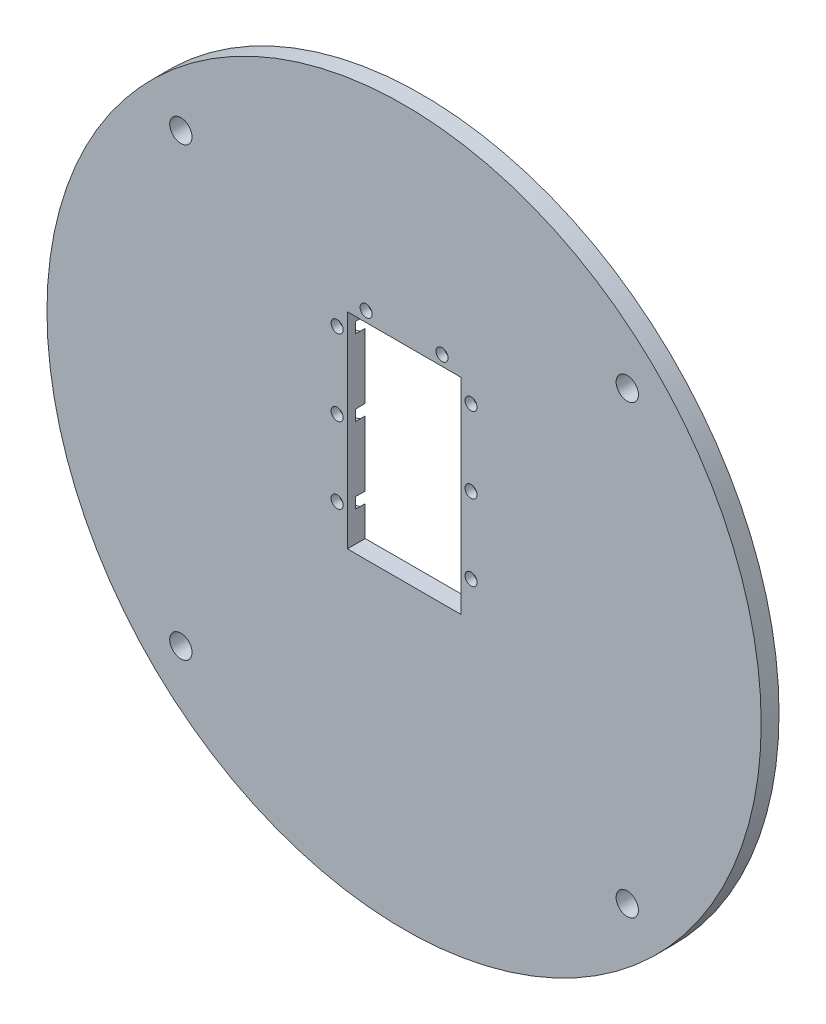
ISO-10303-21;
HEADER;
FILE_DESCRIPTION(('STEP AP214'),'2;1');
FILE_NAME('part.step','',(''),(''),'','','');
FILE_SCHEMA(('AUTOMOTIVE_DESIGN { 1 0 10303 214 1 1 1 1 }'));
ENDSEC;
DATA;
#1=APPLICATION_CONTEXT('core data for automotive mechanical design processes');
#2=APPLICATION_PROTOCOL_DEFINITION('international standard','automotive_design',2000,#1);
#3=PRODUCT_CONTEXT('',#1,'mechanical');
#4=PRODUCT('Part','Part','',(#3));
#5=PRODUCT_RELATED_PRODUCT_CATEGORY('part','',(#4));
#6=PRODUCT_DEFINITION_FORMATION('','',#4);
#7=PRODUCT_DEFINITION_CONTEXT('part definition',#1,'design');
#8=PRODUCT_DEFINITION('design','',#6,#7);
#9=PRODUCT_DEFINITION_SHAPE('','',#8);
#10=(LENGTH_UNIT() NAMED_UNIT(*) SI_UNIT(.MILLI.,.METRE.));
#11=(NAMED_UNIT(*) PLANE_ANGLE_UNIT() SI_UNIT($,.RADIAN.));
#12=(NAMED_UNIT(*) SI_UNIT($,.STERADIAN.) SOLID_ANGLE_UNIT());
#13=UNCERTAINTY_MEASURE_WITH_UNIT(LENGTH_MEASURE(1.E-05),#10,'distance_accuracy_value','');
#14=(GEOMETRIC_REPRESENTATION_CONTEXT(3) GLOBAL_UNCERTAINTY_ASSIGNED_CONTEXT((#13)) GLOBAL_UNIT_ASSIGNED_CONTEXT((#10,
#11,#12)) REPRESENTATION_CONTEXT('',''));
#15=CARTESIAN_POINT('',(0.,0.,0.));
#16=DIRECTION('',(0.,0.,1.));
#17=DIRECTION('',(1.,0.,0.));
#18=AXIS2_PLACEMENT_3D('',#15,#16,#17);
#19=CARTESIAN_POINT('',(-15.,-4.5,500000.));
#20=DIRECTION('',(0.,0.,-1.));
#21=DIRECTION('',(-1.,0.,0.));
#22=AXIS2_PLACEMENT_3D('',#19,#20,#21);
#23=CYLINDRICAL_SURFACE('',#22,1.35);
#24=CARTESIAN_POINT('',(-15.,-4.5,4.0000000000191));
#25=DIRECTION('',(0.,0.,1.));
#26=DIRECTION('',(1.,0.,0.));
#27=AXIS2_PLACEMENT_3D('',#24,#25,#26);
#28=CIRCLE('',#27,1.35);
#29=CARTESIAN_POINT('',(-13.65,-4.5,4.0000000000191));
#30=VERTEX_POINT('',#29);
#31=EDGE_CURVE('E289',#30,#30,#28,.T.);
#32=ORIENTED_EDGE('',*,*,#31,.T.);
#33=EDGE_LOOP('',(#32));
#34=FACE_BOUND('',#33,.T.);
#35=CARTESIAN_POINT('',(-15.,-4.5,2.20000000001619));
#36=DIRECTION('',(0.,0.,-1.));
#37=DIRECTION('',(-1.,0.,0.));
#38=AXIS2_PLACEMENT_3D('',#35,#36,#37);
#39=CIRCLE('',#38,1.35);
#40=CARTESIAN_POINT('',(-16.35,-4.5,2.20000000001619));
#41=VERTEX_POINT('',#40);
#42=EDGE_CURVE('E398',#41,#41,#39,.T.);
#43=ORIENTED_EDGE('',*,*,#42,.T.);
#44=EDGE_LOOP('',(#43));
#45=FACE_BOUND('',#44,.T.);
#46=ADVANCED_FACE('F40',(#34,#45),#23,.F.);
#47=CARTESIAN_POINT('',(15.,-4.5,500000.));
#48=DIRECTION('',(0.,0.,-1.));
#49=DIRECTION('',(-1.,0.,0.));
#50=AXIS2_PLACEMENT_3D('',#47,#48,#49);
#51=CYLINDRICAL_SURFACE('',#50,1.35);
#52=CARTESIAN_POINT('',(15.,-4.5,4.0000000000191));
#53=DIRECTION('',(0.,0.,1.));
#54=DIRECTION('',(1.,0.,0.));
#55=AXIS2_PLACEMENT_3D('',#52,#53,#54);
#56=CIRCLE('',#55,1.35);
#57=CARTESIAN_POINT('',(16.35,-4.5,4.0000000000191));
#58=VERTEX_POINT('',#57);
#59=EDGE_CURVE('E318',#58,#58,#56,.T.);
#60=ORIENTED_EDGE('',*,*,#59,.T.);
#61=EDGE_LOOP('',(#60));
#62=FACE_BOUND('',#61,.T.);
#63=CARTESIAN_POINT('',(15.,-4.5,2.20000000001619));
#64=DIRECTION('',(0.,0.,-1.));
#65=DIRECTION('',(-1.,0.,0.));
#66=AXIS2_PLACEMENT_3D('',#63,#64,#65);
#67=CIRCLE('',#66,1.35);
#68=CARTESIAN_POINT('',(13.65,-4.5,2.20000000001619));
#69=VERTEX_POINT('',#68);
#70=EDGE_CURVE('E390',#69,#69,#67,.T.);
#71=ORIENTED_EDGE('',*,*,#70,.T.);
#72=EDGE_LOOP('',(#71));
#73=FACE_BOUND('',#72,.T.);
#74=ADVANCED_FACE('F602',(#62,#73),#51,.F.);
#75=CARTESIAN_POINT('',(15.,12.5,500000.));
#76=DIRECTION('',(0.,0.,-1.));
#77=DIRECTION('',(-1.,0.,0.));
#78=AXIS2_PLACEMENT_3D('',#75,#76,#77);
#79=CYLINDRICAL_SURFACE('',#78,1.35);
#80=CARTESIAN_POINT('',(15.,12.5,4.0000000000191));
#81=DIRECTION('',(0.,0.,1.));
#82=DIRECTION('',(1.,0.,0.));
#83=AXIS2_PLACEMENT_3D('',#80,#81,#82);
#84=CIRCLE('',#83,1.35);
#85=CARTESIAN_POINT('',(16.35,12.5,4.0000000000191));
#86=VERTEX_POINT('',#85);
#87=EDGE_CURVE('E314',#86,#86,#84,.T.);
#88=ORIENTED_EDGE('',*,*,#87,.T.);
#89=EDGE_LOOP('',(#88));
#90=FACE_BOUND('',#89,.T.);
#91=CARTESIAN_POINT('',(15.,12.5,2.20000000001619));
#92=DIRECTION('',(0.,0.,-1.));
#93=DIRECTION('',(-1.,0.,0.));
#94=AXIS2_PLACEMENT_3D('',#91,#92,#93);
#95=CIRCLE('',#94,1.35);
#96=CARTESIAN_POINT('',(13.65,12.5,2.20000000001619));
#97=VERTEX_POINT('',#96);
#98=EDGE_CURVE('E378',#97,#97,#95,.T.);
#99=ORIENTED_EDGE('',*,*,#98,.T.);
#100=EDGE_LOOP('',(#99));
#101=FACE_BOUND('',#100,.T.);
#102=ADVANCED_FACE('F609',(#90,#101),#79,.F.);
#103=CARTESIAN_POINT('',(15.,29.5,500000.));
#104=DIRECTION('',(0.,0.,-1.));
#105=DIRECTION('',(-1.,0.,0.));
#106=AXIS2_PLACEMENT_3D('',#103,#104,#105);
#107=CYLINDRICAL_SURFACE('',#106,1.35);
#108=CARTESIAN_POINT('',(15.,29.5,4.0000000000191));
#109=DIRECTION('',(0.,0.,1.));
#110=DIRECTION('',(1.,0.,0.));
#111=AXIS2_PLACEMENT_3D('',#108,#109,#110);
#112=CIRCLE('',#111,1.35);
#113=CARTESIAN_POINT('',(16.35,29.5,4.0000000000191));
#114=VERTEX_POINT('',#113);
#115=EDGE_CURVE('E310',#114,#114,#112,.T.);
#116=ORIENTED_EDGE('',*,*,#115,.T.);
#117=EDGE_LOOP('',(#116));
#118=FACE_BOUND('',#117,.T.);
#119=CARTESIAN_POINT('',(15.,29.5,2.20000000001619));
#120=DIRECTION('',(0.,0.,-1.));
#121=DIRECTION('',(-1.,0.,0.));
#122=AXIS2_PLACEMENT_3D('',#119,#120,#121);
#123=CIRCLE('',#122,1.35);
#124=CARTESIAN_POINT('',(13.65,29.5,2.20000000001619));
#125=VERTEX_POINT('',#124);
#126=EDGE_CURVE('E366',#125,#125,#123,.T.);
#127=ORIENTED_EDGE('',*,*,#126,.T.);
#128=EDGE_LOOP('',(#127));
#129=FACE_BOUND('',#128,.T.);
#130=ADVANCED_FACE('F794',(#118,#129),#107,.F.);
#131=CARTESIAN_POINT('',(8.5,35.8,500000.));
#132=DIRECTION('',(0.,0.,-1.));
#133=DIRECTION('',(-1.,0.,0.));
#134=AXIS2_PLACEMENT_3D('',#131,#132,#133);
#135=CYLINDRICAL_SURFACE('',#134,1.35);
#136=CARTESIAN_POINT('',(8.5,35.8,4.0000000000191));
#137=DIRECTION('',(0.,0.,1.));
#138=DIRECTION('',(1.,0.,0.));
#139=AXIS2_PLACEMENT_3D('',#136,#137,#138);
#140=CIRCLE('',#139,1.35);
#141=CARTESIAN_POINT('',(9.85,35.8,4.0000000000191));
#142=VERTEX_POINT('',#141);
#143=EDGE_CURVE('E306',#142,#142,#140,.T.);
#144=ORIENTED_EDGE('',*,*,#143,.T.);
#145=EDGE_LOOP('',(#144));
#146=FACE_BOUND('',#145,.T.);
#147=CARTESIAN_POINT('',(8.5,35.8,2.20000000001619));
#148=DIRECTION('',(0.,0.,-1.));
#149=DIRECTION('',(-1.,0.,0.));
#150=AXIS2_PLACEMENT_3D('',#147,#148,#149);
#151=CIRCLE('',#150,1.35);
#152=CARTESIAN_POINT('',(7.15,35.8,2.20000000001619));
#153=VERTEX_POINT('',#152);
#154=EDGE_CURVE('E355',#153,#153,#151,.T.);
#155=ORIENTED_EDGE('',*,*,#154,.T.);
#156=EDGE_LOOP('',(#155));
#157=FACE_BOUND('',#156,.T.);
#158=ADVANCED_FACE('F802',(#146,#157),#135,.F.);
#159=CARTESIAN_POINT('',(-8.5,35.8,500000.));
#160=DIRECTION('',(0.,0.,-1.));
#161=DIRECTION('',(-1.,0.,0.));
#162=AXIS2_PLACEMENT_3D('',#159,#160,#161);
#163=CYLINDRICAL_SURFACE('',#162,1.35);
#164=CARTESIAN_POINT('',(-8.5,35.8,4.0000000000191));
#165=DIRECTION('',(0.,0.,1.));
#166=DIRECTION('',(1.,0.,0.));
#167=AXIS2_PLACEMENT_3D('',#164,#165,#166);
#168=CIRCLE('',#167,1.35);
#169=CARTESIAN_POINT('',(-7.15,35.8,4.0000000000191));
#170=VERTEX_POINT('',#169);
#171=EDGE_CURVE('E302',#170,#170,#168,.T.);
#172=ORIENTED_EDGE('',*,*,#171,.T.);
#173=EDGE_LOOP('',(#172));
#174=FACE_BOUND('',#173,.T.);
#175=CARTESIAN_POINT('',(-8.5,35.8,2.20000000001619));
#176=DIRECTION('',(0.,0.,-1.));
#177=DIRECTION('',(-1.,0.,0.));
#178=AXIS2_PLACEMENT_3D('',#175,#176,#177);
#179=CIRCLE('',#178,1.35);
#180=CARTESIAN_POINT('',(-9.85,35.8,2.20000000001619));
#181=VERTEX_POINT('',#180);
#182=EDGE_CURVE('E345',#181,#181,#179,.T.);
#183=ORIENTED_EDGE('',*,*,#182,.T.);
#184=EDGE_LOOP('',(#183));
#185=FACE_BOUND('',#184,.T.);
#186=ADVANCED_FACE('F811',(#174,#185),#163,.F.);
#187=CARTESIAN_POINT('',(-15.,29.5,500000.));
#188=DIRECTION('',(0.,0.,-1.));
#189=DIRECTION('',(-1.,0.,0.));
#190=AXIS2_PLACEMENT_3D('',#187,#188,#189);
#191=CYLINDRICAL_SURFACE('',#190,1.35);
#192=CARTESIAN_POINT('',(-15.,29.5,4.0000000000191));
#193=DIRECTION('',(0.,0.,1.));
#194=DIRECTION('',(1.,0.,0.));
#195=AXIS2_PLACEMENT_3D('',#192,#193,#194);
#196=CIRCLE('',#195,1.35);
#197=CARTESIAN_POINT('',(-13.65,29.5,4.0000000000191));
#198=VERTEX_POINT('',#197);
#199=EDGE_CURVE('E298',#198,#198,#196,.T.);
#200=ORIENTED_EDGE('',*,*,#199,.T.);
#201=EDGE_LOOP('',(#200));
#202=FACE_BOUND('',#201,.T.);
#203=CARTESIAN_POINT('',(-15.,29.5,2.20000000001619));
#204=DIRECTION('',(0.,0.,-1.));
#205=DIRECTION('',(-1.,0.,0.));
#206=AXIS2_PLACEMENT_3D('',#203,#204,#205);
#207=CIRCLE('',#206,1.35);
#208=CARTESIAN_POINT('',(-16.35,29.5,2.20000000001619));
#209=VERTEX_POINT('',#208);
#210=EDGE_CURVE('E335',#209,#209,#207,.T.);
#211=ORIENTED_EDGE('',*,*,#210,.T.);
#212=EDGE_LOOP('',(#211));
#213=FACE_BOUND('',#212,.T.);
#214=ADVANCED_FACE('F820',(#202,#213),#191,.F.);
#215=CARTESIAN_POINT('',(-15.,12.5,500000.));
#216=DIRECTION('',(0.,0.,-1.));
#217=DIRECTION('',(-1.,0.,0.));
#218=AXIS2_PLACEMENT_3D('',#215,#216,#217);
#219=CYLINDRICAL_SURFACE('',#218,1.35);
#220=CARTESIAN_POINT('',(-15.,12.5,4.0000000000191));
#221=DIRECTION('',(0.,0.,1.));
#222=DIRECTION('',(1.,0.,0.));
#223=AXIS2_PLACEMENT_3D('',#220,#221,#222);
#224=CIRCLE('',#223,1.35);
#225=CARTESIAN_POINT('',(-13.65,12.5,4.0000000000191));
#226=VERTEX_POINT('',#225);
#227=EDGE_CURVE('E294',#226,#226,#224,.T.);
#228=ORIENTED_EDGE('',*,*,#227,.T.);
#229=EDGE_LOOP('',(#228));
#230=FACE_BOUND('',#229,.T.);
#231=CARTESIAN_POINT('',(-15.,12.5,2.20000000001619));
#232=DIRECTION('',(0.,0.,-1.));
#233=DIRECTION('',(-1.,0.,0.));
#234=AXIS2_PLACEMENT_3D('',#231,#232,#233);
#235=CIRCLE('',#234,1.35);
#236=CARTESIAN_POINT('',(-16.35,12.5,2.20000000001619));
#237=VERTEX_POINT('',#236);
#238=EDGE_CURVE('E325',#237,#237,#235,.T.);
#239=ORIENTED_EDGE('',*,*,#238,.T.);
#240=EDGE_LOOP('',(#239));
#241=FACE_BOUND('',#240,.T.);
#242=ADVANCED_FACE('F614',(#230,#241),#219,.F.);
#243=CARTESIAN_POINT('',(-50.,-50.,4.));
#244=DIRECTION('',(0.,0.,-1.));
#245=DIRECTION('',(-1.,0.,0.));
#246=AXIS2_PLACEMENT_3D('',#243,#244,#245);
#247=CYLINDRICAL_SURFACE('',#246,2.5);
#248=CARTESIAN_POINT('',(-50.,-50.,4.));
#249=DIRECTION('',(0.,0.,1.));
#250=DIRECTION('',(1.,0.,0.));
#251=AXIS2_PLACEMENT_3D('',#248,#249,#250);
#252=CIRCLE('',#251,2.5);
#253=CARTESIAN_POINT('',(-47.5,-50.,4.));
#254=VERTEX_POINT('',#253);
#255=EDGE_CURVE('E499',#254,#254,#252,.T.);
#256=ORIENTED_EDGE('',*,*,#255,.T.);
#257=EDGE_LOOP('',(#256));
#258=FACE_BOUND('',#257,.T.);
#259=CARTESIAN_POINT('',(-50.,-50.,0.));
#260=DIRECTION('',(0.,0.,1.));
#261=DIRECTION('',(1.,0.,0.));
#262=AXIS2_PLACEMENT_3D('',#259,#260,#261);
#263=CIRCLE('',#262,2.5);
#264=CARTESIAN_POINT('',(-47.5,-50.,0.));
#265=VERTEX_POINT('',#264);
#266=EDGE_CURVE('E485',#265,#265,#263,.T.);
#267=ORIENTED_EDGE('',*,*,#266,.F.);
#268=EDGE_LOOP('',(#267));
#269=FACE_BOUND('',#268,.T.);
#270=ADVANCED_FACE('F634',(#258,#269),#247,.F.);
#271=CARTESIAN_POINT('',(-50.,50.,4.));
#272=DIRECTION('',(0.,0.,-1.));
#273=DIRECTION('',(-1.,0.,0.));
#274=AXIS2_PLACEMENT_3D('',#271,#272,#273);
#275=CYLINDRICAL_SURFACE('',#274,2.5);
#276=CARTESIAN_POINT('',(-50.,50.,4.));
#277=DIRECTION('',(0.,0.,1.));
#278=DIRECTION('',(1.,0.,0.));
#279=AXIS2_PLACEMENT_3D('',#276,#277,#278);
#280=CIRCLE('',#279,2.5);
#281=CARTESIAN_POINT('',(-47.5,50.,4.));
#282=VERTEX_POINT('',#281);
#283=EDGE_CURVE('E503',#282,#282,#280,.T.);
#284=ORIENTED_EDGE('',*,*,#283,.T.);
#285=EDGE_LOOP('',(#284));
#286=FACE_BOUND('',#285,.T.);
#287=CARTESIAN_POINT('',(-50.,50.,0.));
#288=DIRECTION('',(0.,0.,1.));
#289=DIRECTION('',(1.,0.,0.));
#290=AXIS2_PLACEMENT_3D('',#287,#288,#289);
#291=CIRCLE('',#290,2.5);
#292=CARTESIAN_POINT('',(-47.5,50.,0.));
#293=VERTEX_POINT('',#292);
#294=EDGE_CURVE('E489',#293,#293,#291,.T.);
#295=ORIENTED_EDGE('',*,*,#294,.F.);
#296=EDGE_LOOP('',(#295));
#297=FACE_BOUND('',#296,.T.);
#298=ADVANCED_FACE('F637',(#286,#297),#275,.F.);
#299=CARTESIAN_POINT('',(50.,50.,4.));
#300=DIRECTION('',(0.,0.,-1.));
#301=DIRECTION('',(-1.,0.,0.));
#302=AXIS2_PLACEMENT_3D('',#299,#300,#301);
#303=CYLINDRICAL_SURFACE('',#302,2.5);
#304=CARTESIAN_POINT('',(50.,50.,4.));
#305=DIRECTION('',(0.,0.,1.));
#306=DIRECTION('',(1.,0.,0.));
#307=AXIS2_PLACEMENT_3D('',#304,#305,#306);
#308=CIRCLE('',#307,2.5);
#309=CARTESIAN_POINT('',(52.5,50.,4.));
#310=VERTEX_POINT('',#309);
#311=EDGE_CURVE('E507',#310,#310,#308,.T.);
#312=ORIENTED_EDGE('',*,*,#311,.T.);
#313=EDGE_LOOP('',(#312));
#314=FACE_BOUND('',#313,.T.);
#315=CARTESIAN_POINT('',(50.,50.,0.));
#316=DIRECTION('',(0.,0.,1.));
#317=DIRECTION('',(1.,0.,0.));
#318=AXIS2_PLACEMENT_3D('',#315,#316,#317);
#319=CIRCLE('',#318,2.5);
#320=CARTESIAN_POINT('',(52.5,50.,0.));
#321=VERTEX_POINT('',#320);
#322=EDGE_CURVE('E253',#321,#321,#319,.T.);
#323=ORIENTED_EDGE('',*,*,#322,.F.);
#324=EDGE_LOOP('',(#323));
#325=FACE_BOUND('',#324,.T.);
#326=ADVANCED_FACE('F640',(#314,#325),#303,.F.);
#327=CARTESIAN_POINT('',(50.,-50.,4.));
#328=DIRECTION('',(0.,0.,-1.));
#329=DIRECTION('',(-1.,0.,0.));
#330=AXIS2_PLACEMENT_3D('',#327,#328,#329);
#331=CYLINDRICAL_SURFACE('',#330,2.5);
#332=CARTESIAN_POINT('',(50.,-50.,4.));
#333=DIRECTION('',(0.,0.,1.));
#334=DIRECTION('',(1.,0.,0.));
#335=AXIS2_PLACEMENT_3D('',#332,#333,#334);
#336=CIRCLE('',#335,2.5);
#337=CARTESIAN_POINT('',(52.5,-50.,4.));
#338=VERTEX_POINT('',#337);
#339=EDGE_CURVE('E484',#338,#338,#336,.T.);
#340=ORIENTED_EDGE('',*,*,#339,.T.);
#341=EDGE_LOOP('',(#340));
#342=FACE_BOUND('',#341,.T.);
#343=CARTESIAN_POINT('',(50.,-50.,0.));
#344=DIRECTION('',(0.,0.,1.));
#345=DIRECTION('',(1.,0.,0.));
#346=AXIS2_PLACEMENT_3D('',#343,#344,#345);
#347=CIRCLE('',#346,2.5);
#348=CARTESIAN_POINT('',(52.5,-50.,0.));
#349=VERTEX_POINT('',#348);
#350=EDGE_CURVE('E245',#349,#349,#347,.T.);
#351=ORIENTED_EDGE('',*,*,#350,.F.);
#352=EDGE_LOOP('',(#351));
#353=FACE_BOUND('',#352,.T.);
#354=ADVANCED_FACE('F42',(#342,#353),#331,.F.);
#355=CARTESIAN_POINT('',(0.,0.,4.));
#356=DIRECTION('',(0.,0.,-1.));
#357=DIRECTION('',(-1.,0.,0.));
#358=AXIS2_PLACEMENT_3D('',#355,#356,#357);
#359=CYLINDRICAL_SURFACE('',#358,80.);
#360=CARTESIAN_POINT('',(0.,0.,4.));
#361=DIRECTION('',(0.,0.,1.));
#362=DIRECTION('',(1.,0.,0.));
#363=AXIS2_PLACEMENT_3D('',#360,#361,#362);
#364=CIRCLE('',#363,80.);
#365=CARTESIAN_POINT('',(80.,0.,4.));
#366=VERTEX_POINT('',#365);
#367=EDGE_CURVE('E477',#366,#366,#364,.T.);
#368=ORIENTED_EDGE('',*,*,#367,.F.);
#369=EDGE_LOOP('',(#368));
#370=FACE_BOUND('',#369,.T.);
#371=CARTESIAN_POINT('',(0.,0.,0.));
#372=DIRECTION('',(0.,0.,1.));
#373=DIRECTION('',(1.,0.,0.));
#374=AXIS2_PLACEMENT_3D('',#371,#372,#373);
#375=CIRCLE('',#374,80.);
#376=CARTESIAN_POINT('',(80.,0.,0.));
#377=VERTEX_POINT('',#376);
#378=EDGE_CURVE('E480',#377,#377,#375,.T.);
#379=ORIENTED_EDGE('',*,*,#378,.T.);
#380=EDGE_LOOP('',(#379));
#381=FACE_BOUND('',#380,.T.);
#382=ADVANCED_FACE('F627',(#370,#381),#359,.T.);
#383=CARTESIAN_POINT('',(0.,0.,4.));
#384=DIRECTION('',(0.,0.,1.));
#385=DIRECTION('',(1.,0.,0.));
#386=AXIS2_PLACEMENT_3D('',#383,#384,#385);
#387=PLANE('',#386);
#388=ORIENTED_EDGE('',*,*,#59,.F.);
#389=EDGE_LOOP('',(#388));
#390=FACE_BOUND('',#389,.T.);
#391=ORIENTED_EDGE('',*,*,#87,.F.);
#392=EDGE_LOOP('',(#391));
#393=FACE_BOUND('',#392,.T.);
#394=ORIENTED_EDGE('',*,*,#115,.F.);
#395=EDGE_LOOP('',(#394));
#396=FACE_BOUND('',#395,.T.);
#397=ORIENTED_EDGE('',*,*,#143,.F.);
#398=EDGE_LOOP('',(#397));
#399=FACE_BOUND('',#398,.T.);
#400=ORIENTED_EDGE('',*,*,#171,.F.);
#401=EDGE_LOOP('',(#400));
#402=FACE_BOUND('',#401,.T.);
#403=ORIENTED_EDGE('',*,*,#199,.F.);
#404=EDGE_LOOP('',(#403));
#405=FACE_BOUND('',#404,.T.);
#406=ORIENTED_EDGE('',*,*,#227,.F.);
#407=EDGE_LOOP('',(#406));
#408=FACE_BOUND('',#407,.T.);
#409=ORIENTED_EDGE('',*,*,#31,.F.);
#410=EDGE_LOOP('',(#409));
#411=FACE_BOUND('',#410,.T.);
#412=DIRECTION('',(1.,0.,0.));
#413=VECTOR('',#412,1.);
#414=CARTESIAN_POINT('',(0.,33.5,4.0000000000191));
#415=LINE('',#414,#413);
#416=CARTESIAN_POINT('',(-12.7,33.5,4.00000000013279));
#417=VERTEX_POINT('',#416);
#418=CARTESIAN_POINT('',(12.7,33.5,4.00000000013279));
#419=VERTEX_POINT('',#418);
#420=EDGE_CURVE('E526',#417,#419,#415,.T.);
#421=ORIENTED_EDGE('',*,*,#420,.T.);
#422=DIRECTION('',(0.,1.,0.));
#423=VECTOR('',#422,1.);
#424=CARTESIAN_POINT('',(12.7,-10.581372337205,4.0000000000191));
#425=LINE('',#424,#423);
#426=CARTESIAN_POINT('',(12.7,-12.5,4.00000000013279));
#427=VERTEX_POINT('',#426);
#428=EDGE_CURVE('E293',#427,#419,#425,.T.);
#429=ORIENTED_EDGE('',*,*,#428,.F.);
#430=DIRECTION('',(1.,0.,0.));
#431=VECTOR('',#430,1.);
#432=CARTESIAN_POINT('',(0.,-12.5,4.0000000000191));
#433=LINE('',#432,#431);
#434=CARTESIAN_POINT('',(-12.7,-12.5,4.));
#435=VERTEX_POINT('',#434);
#436=EDGE_CURVE('E529',#435,#427,#433,.T.);
#437=ORIENTED_EDGE('',*,*,#436,.F.);
#438=DIRECTION('',(0.,1.,0.));
#439=VECTOR('',#438,1.);
#440=CARTESIAN_POINT('',(-12.7,-10.581372337205,4.0000000000191));
#441=LINE('',#440,#439);
#442=EDGE_CURVE('E533',#435,#417,#441,.T.);
#443=ORIENTED_EDGE('',*,*,#442,.T.);
#444=EDGE_LOOP('',(#421,#429,#437,#443));
#445=FACE_BOUND('',#444,.T.);
#446=ORIENTED_EDGE('',*,*,#339,.F.);
#447=EDGE_LOOP('',(#446));
#448=FACE_BOUND('',#447,.T.);
#449=ORIENTED_EDGE('',*,*,#311,.F.);
#450=EDGE_LOOP('',(#449));
#451=FACE_BOUND('',#450,.T.);
#452=ORIENTED_EDGE('',*,*,#283,.F.);
#453=EDGE_LOOP('',(#452));
#454=FACE_BOUND('',#453,.T.);
#455=ORIENTED_EDGE('',*,*,#255,.F.);
#456=EDGE_LOOP('',(#455));
#457=FACE_BOUND('',#456,.T.);
#458=ORIENTED_EDGE('',*,*,#367,.T.);
#459=EDGE_LOOP('',(#458));
#460=FACE_BOUND('',#459,.T.);
#461=ADVANCED_FACE('F541',(#390,#393,#396,#399,#402,#405,#408,#411,#445,#448,#451,#454,#457,
#460),#387,.T.);
#462=CARTESIAN_POINT('',(0.,0.,0.));
#463=DIRECTION('',(0.,0.,1.));
#464=DIRECTION('',(1.,0.,0.));
#465=AXIS2_PLACEMENT_3D('',#462,#463,#464);
#466=PLANE('',#465);
#467=DIRECTION('',(0.,1.,0.));
#468=VECTOR('',#467,1.);
#469=CARTESIAN_POINT('',(-12.7,-10.581372337205,0.));
#470=LINE('',#469,#468);
#471=CARTESIAN_POINT('',(-12.7,-3.28756443470179,0.));
#472=VERTEX_POINT('',#471);
#473=CARTESIAN_POINT('',(-12.7,11.2875644347018,0.));
#474=VERTEX_POINT('',#473);
#475=EDGE_CURVE('E237',#472,#474,#470,.T.);
#476=ORIENTED_EDGE('',*,*,#475,.F.);
#477=CARTESIAN_POINT('',(-15.,-4.5,0.));
#478=DIRECTION('',(0.,0.,-1.));
#479=DIRECTION('',(1.,0.,0.));
#480=AXIS2_PLACEMENT_3D('',#477,#478,#479);
#481=CIRCLE('',#480,2.6);
#482=CARTESIAN_POINT('',(-12.7,-5.71243556529822,0.));
#483=VERTEX_POINT('',#482);
#484=EDGE_CURVE('E223',#483,#472,#481,.T.);
#485=ORIENTED_EDGE('',*,*,#484,.F.);
#486=CARTESIAN_POINT('',(-12.7,-12.5,0.));
#487=VERTEX_POINT('',#486);
#488=EDGE_CURVE('E235',#487,#483,#470,.T.);
#489=ORIENTED_EDGE('',*,*,#488,.F.);
#490=DIRECTION('',(1.,0.,0.));
#491=VECTOR('',#490,1.);
#492=CARTESIAN_POINT('',(0.,-12.5,0.));
#493=LINE('',#492,#491);
#494=CARTESIAN_POINT('',(12.7,-12.5,0.));
#495=VERTEX_POINT('',#494);
#496=EDGE_CURVE('E266',#487,#495,#493,.T.);
#497=ORIENTED_EDGE('',*,*,#496,.T.);
#498=DIRECTION('',(0.,1.,0.));
#499=VECTOR('',#498,1.);
#500=CARTESIAN_POINT('',(12.7,-10.581372337205,0.));
#501=LINE('',#500,#499);
#502=CARTESIAN_POINT('',(12.7,-5.7124355652982,0.));
#503=VERTEX_POINT('',#502);
#504=EDGE_CURVE('E274',#495,#503,#501,.T.);
#505=ORIENTED_EDGE('',*,*,#504,.T.);
#506=CARTESIAN_POINT('',(15.,-4.5,0.));
#507=DIRECTION('',(0.,0.,-1.));
#508=DIRECTION('',(1.,0.,0.));
#509=AXIS2_PLACEMENT_3D('',#506,#507,#508);
#510=CIRCLE('',#509,2.6);
#511=CARTESIAN_POINT('',(12.7,-3.2875644347018,0.));
#512=VERTEX_POINT('',#511);
#513=EDGE_CURVE('E391',#512,#503,#510,.T.);
#514=ORIENTED_EDGE('',*,*,#513,.F.);
#515=CARTESIAN_POINT('',(12.7,11.2875644347018,0.));
#516=VERTEX_POINT('',#515);
#517=EDGE_CURVE('E279',#512,#516,#501,.T.);
#518=ORIENTED_EDGE('',*,*,#517,.T.);
#519=CARTESIAN_POINT('',(15.,12.5,0.));
#520=DIRECTION('',(0.,0.,-1.));
#521=DIRECTION('',(1.,0.,0.));
#522=AXIS2_PLACEMENT_3D('',#519,#520,#521);
#523=CIRCLE('',#522,2.6);
#524=CARTESIAN_POINT('',(12.7,13.7124355652982,0.));
#525=VERTEX_POINT('',#524);
#526=EDGE_CURVE('E379',#525,#516,#523,.T.);
#527=ORIENTED_EDGE('',*,*,#526,.F.);
#528=CARTESIAN_POINT('',(12.7,28.2875644347018,0.));
#529=VERTEX_POINT('',#528);
#530=EDGE_CURVE('E562',#525,#529,#501,.T.);
#531=ORIENTED_EDGE('',*,*,#530,.T.);
#532=CARTESIAN_POINT('',(15.,29.5,0.));
#533=DIRECTION('',(0.,0.,-1.));
#534=DIRECTION('',(1.,0.,0.));
#535=AXIS2_PLACEMENT_3D('',#532,#533,#534);
#536=CIRCLE('',#535,2.6);
#537=CARTESIAN_POINT('',(12.7,30.7124355652982,0.));
#538=VERTEX_POINT('',#537);
#539=EDGE_CURVE('E367',#538,#529,#536,.T.);
#540=ORIENTED_EDGE('',*,*,#539,.F.);
#541=CARTESIAN_POINT('',(12.7,33.5,0.));
#542=VERTEX_POINT('',#541);
#543=EDGE_CURVE('E281',#538,#542,#501,.T.);
#544=ORIENTED_EDGE('',*,*,#543,.T.);
#545=DIRECTION('',(1.,0.,0.));
#546=VECTOR('',#545,1.);
#547=CARTESIAN_POINT('',(0.,33.5,0.));
#548=LINE('',#547,#546);
#549=CARTESIAN_POINT('',(9.71243556529815,33.5,0.));
#550=VERTEX_POINT('',#549);
#551=EDGE_CURVE('E288',#550,#542,#548,.T.);
#552=ORIENTED_EDGE('',*,*,#551,.F.);
#553=CARTESIAN_POINT('',(8.5,35.8,0.));
#554=DIRECTION('',(0.,0.,-1.));
#555=DIRECTION('',(1.,0.,0.));
#556=AXIS2_PLACEMENT_3D('',#553,#554,#555);
#557=CIRCLE('',#556,2.6);
#558=CARTESIAN_POINT('',(7.28756443470186,33.5,0.));
#559=VERTEX_POINT('',#558);
#560=EDGE_CURVE('E356',#559,#550,#557,.T.);
#561=ORIENTED_EDGE('',*,*,#560,.F.);
#562=CARTESIAN_POINT('',(-7.28756443470187,33.5,0.));
#563=VERTEX_POINT('',#562);
#564=EDGE_CURVE('E287',#563,#559,#548,.T.);
#565=ORIENTED_EDGE('',*,*,#564,.F.);
#566=CARTESIAN_POINT('',(-8.5,35.8,0.));
#567=DIRECTION('',(0.,0.,-1.));
#568=DIRECTION('',(1.,0.,0.));
#569=AXIS2_PLACEMENT_3D('',#566,#567,#568);
#570=CIRCLE('',#569,2.6);
#571=CARTESIAN_POINT('',(-9.71243556529815,33.5,0.));
#572=VERTEX_POINT('',#571);
#573=EDGE_CURVE('E346',#572,#563,#570,.T.);
#574=ORIENTED_EDGE('',*,*,#573,.F.);
#575=CARTESIAN_POINT('',(-12.7,33.5,0.));
#576=VERTEX_POINT('',#575);
#577=EDGE_CURVE('E283',#576,#572,#548,.T.);
#578=ORIENTED_EDGE('',*,*,#577,.F.);
#579=CARTESIAN_POINT('',(-12.7,30.7124355652982,0.));
#580=VERTEX_POINT('',#579);
#581=EDGE_CURVE('E256',#580,#576,#470,.T.);
#582=ORIENTED_EDGE('',*,*,#581,.F.);
#583=CARTESIAN_POINT('',(-15.,29.5,0.));
#584=DIRECTION('',(0.,0.,-1.));
#585=DIRECTION('',(1.,0.,0.));
#586=AXIS2_PLACEMENT_3D('',#583,#584,#585);
#587=CIRCLE('',#586,2.6);
#588=CARTESIAN_POINT('',(-12.7,28.2875644347018,0.));
#589=VERTEX_POINT('',#588);
#590=EDGE_CURVE('E336',#589,#580,#587,.T.);
#591=ORIENTED_EDGE('',*,*,#590,.F.);
#592=CARTESIAN_POINT('',(-12.7,13.7124355652982,0.));
#593=VERTEX_POINT('',#592);
#594=EDGE_CURVE('E247',#593,#589,#470,.T.);
#595=ORIENTED_EDGE('',*,*,#594,.F.);
#596=CARTESIAN_POINT('',(-15.,12.5,0.));
#597=DIRECTION('',(0.,0.,-1.));
#598=DIRECTION('',(1.,0.,0.));
#599=AXIS2_PLACEMENT_3D('',#596,#597,#598);
#600=CIRCLE('',#599,2.6);
#601=EDGE_CURVE('E326',#474,#593,#600,.T.);
#602=ORIENTED_EDGE('',*,*,#601,.F.);
#603=EDGE_LOOP('',(#476,#485,#489,#497,#505,#514,#518,#527,#531,#540,#544,#552,#561,#565,#574,
#578,#582,#591,#595,#602));
#604=FACE_BOUND('',#603,.T.);
#605=ORIENTED_EDGE('',*,*,#350,.T.);
#606=EDGE_LOOP('',(#605));
#607=FACE_BOUND('',#606,.T.);
#608=ORIENTED_EDGE('',*,*,#322,.T.);
#609=EDGE_LOOP('',(#608));
#610=FACE_BOUND('',#609,.T.);
#611=ORIENTED_EDGE('',*,*,#294,.T.);
#612=EDGE_LOOP('',(#611));
#613=FACE_BOUND('',#612,.T.);
#614=ORIENTED_EDGE('',*,*,#266,.T.);
#615=EDGE_LOOP('',(#614));
#616=FACE_BOUND('',#615,.T.);
#617=ORIENTED_EDGE('',*,*,#378,.F.);
#618=EDGE_LOOP('',(#617));
#619=FACE_BOUND('',#618,.T.);
#620=ADVANCED_FACE('F232',(#604,#607,#610,#613,#616,#619),#466,.F.);
#621=CARTESIAN_POINT('',(0.,33.5,500000.));
#622=DIRECTION('',(0.,1.,0.));
#623=DIRECTION('',(0.,0.,1.));
#624=AXIS2_PLACEMENT_3D('',#621,#622,#623);
#625=PLANE('',#624);
#626=DIRECTION('',(-1.,0.,0.));
#627=VECTOR('',#626,1.);
#628=CARTESIAN_POINT('',(0.,33.5,2.20000000001619));
#629=LINE('',#628,#627);
#630=CARTESIAN_POINT('',(9.71243556529815,33.5,2.2));
#631=VERTEX_POINT('',#630);
#632=CARTESIAN_POINT('',(7.28756443470186,33.5,2.2));
#633=VERTEX_POINT('',#632);
#634=EDGE_CURVE('E350',#631,#633,#629,.T.);
#635=ORIENTED_EDGE('',*,*,#634,.F.);
#636=DIRECTION('',(0.,0.,-1.));
#637=VECTOR('',#636,1.);
#638=CARTESIAN_POINT('',(9.71243556529815,33.5,2.2));
#639=LINE('',#638,#637);
#640=EDGE_CURVE('E436',#631,#550,#639,.T.);
#641=ORIENTED_EDGE('',*,*,#640,.T.);
#642=ORIENTED_EDGE('',*,*,#551,.T.);
#643=DIRECTION('',(0.,0.,-1.));
#644=VECTOR('',#643,1.);
#645=CARTESIAN_POINT('',(12.7,33.5,500000.));
#646=LINE('',#645,#644);
#647=EDGE_CURVE('E517',#419,#542,#646,.T.);
#648=ORIENTED_EDGE('',*,*,#647,.F.);
#649=ORIENTED_EDGE('',*,*,#420,.F.);
#650=DIRECTION('',(0.,0.,-1.));
#651=VECTOR('',#650,1.);
#652=CARTESIAN_POINT('',(-12.7,33.5,500000.));
#653=LINE('',#652,#651);
#654=EDGE_CURVE('E514',#417,#576,#653,.T.);
#655=ORIENTED_EDGE('',*,*,#654,.T.);
#656=ORIENTED_EDGE('',*,*,#577,.T.);
#657=DIRECTION('',(0.,0.,-1.));
#658=VECTOR('',#657,1.);
#659=CARTESIAN_POINT('',(-9.71243556529815,33.5,2.2));
#660=LINE('',#659,#658);
#661=CARTESIAN_POINT('',(-9.71243556529815,33.5,2.2));
#662=VERTEX_POINT('',#661);
#663=EDGE_CURVE('E454',#572,#662,#660,.F.);
#664=ORIENTED_EDGE('',*,*,#663,.T.);
#665=DIRECTION('',(-1.,0.,0.));
#666=VECTOR('',#665,1.);
#667=CARTESIAN_POINT('',(0.,33.5,2.20000000001619));
#668=LINE('',#667,#666);
#669=CARTESIAN_POINT('',(-7.28756443470187,33.5,2.2));
#670=VERTEX_POINT('',#669);
#671=EDGE_CURVE('E340',#670,#662,#668,.T.);
#672=ORIENTED_EDGE('',*,*,#671,.F.);
#673=DIRECTION('',(0.,0.,-1.));
#674=VECTOR('',#673,1.);
#675=CARTESIAN_POINT('',(-7.28756443470187,33.5,2.2));
#676=LINE('',#675,#674);
#677=EDGE_CURVE('E447',#670,#563,#676,.T.);
#678=ORIENTED_EDGE('',*,*,#677,.T.);
#679=ORIENTED_EDGE('',*,*,#564,.T.);
#680=DIRECTION('',(0.,0.,-1.));
#681=VECTOR('',#680,1.);
#682=CARTESIAN_POINT('',(7.28756443470186,33.5,2.2));
#683=LINE('',#682,#681);
#684=EDGE_CURVE('E443',#559,#633,#683,.F.);
#685=ORIENTED_EDGE('',*,*,#684,.T.);
#686=EDGE_LOOP('',(#635,#641,#642,#648,#649,#655,#656,#664,#672,#678,#679,#685));
#687=FACE_BOUND('',#686,.T.);
#688=ADVANCED_FACE('F547',(#687),#625,.F.);
#689=CARTESIAN_POINT('',(12.7,-10.581372337205,500000.));
#690=DIRECTION('',(-1.,0.,0.));
#691=DIRECTION('',(0.,0.,1.));
#692=AXIS2_PLACEMENT_3D('',#689,#690,#691);
#693=PLANE('',#692);
#694=DIRECTION('',(0.,0.,-1.));
#695=VECTOR('',#694,1.);
#696=CARTESIAN_POINT('',(12.7,-3.2875644347018,2.2));
#697=LINE('',#696,#695);
#698=CARTESIAN_POINT('',(12.7,-3.2875644347018,2.2));
#699=VERTEX_POINT('',#698);
#700=EDGE_CURVE('E228',#699,#512,#697,.T.);
#701=ORIENTED_EDGE('',*,*,#700,.F.);
#702=DIRECTION('',(0.,-1.,0.));
#703=VECTOR('',#702,1.);
#704=CARTESIAN_POINT('',(12.7,-10.581372337205,2.20000000001619));
#705=LINE('',#704,#703);
#706=CARTESIAN_POINT('',(12.7,-5.7124355652982,2.2));
#707=VERTEX_POINT('',#706);
#708=EDGE_CURVE('E384',#699,#707,#705,.T.);
#709=ORIENTED_EDGE('',*,*,#708,.T.);
#710=DIRECTION('',(0.,0.,-1.));
#711=VECTOR('',#710,1.);
#712=CARTESIAN_POINT('',(12.7,-5.7124355652982,2.2));
#713=LINE('',#712,#711);
#714=EDGE_CURVE('E413',#503,#707,#713,.F.);
#715=ORIENTED_EDGE('',*,*,#714,.F.);
#716=ORIENTED_EDGE('',*,*,#504,.F.);
#717=DIRECTION('',(0.,0.,-1.));
#718=VECTOR('',#717,1.);
#719=CARTESIAN_POINT('',(12.7,-12.5,500000.));
#720=LINE('',#719,#718);
#721=EDGE_CURVE('E520',#427,#495,#720,.T.);
#722=ORIENTED_EDGE('',*,*,#721,.F.);
#723=ORIENTED_EDGE('',*,*,#428,.T.);
#724=ORIENTED_EDGE('',*,*,#647,.T.);
#725=ORIENTED_EDGE('',*,*,#543,.F.);
#726=DIRECTION('',(0.,0.,-1.));
#727=VECTOR('',#726,1.);
#728=CARTESIAN_POINT('',(12.7,30.7124355652982,2.2));
#729=LINE('',#728,#727);
#730=CARTESIAN_POINT('',(12.7,30.7124355652982,2.2));
#731=VERTEX_POINT('',#730);
#732=EDGE_CURVE('E426',#731,#538,#729,.T.);
#733=ORIENTED_EDGE('',*,*,#732,.F.);
#734=DIRECTION('',(0.,-1.,0.));
#735=VECTOR('',#734,1.);
#736=CARTESIAN_POINT('',(12.7,-10.581372337205,2.20000000001619));
#737=LINE('',#736,#735);
#738=CARTESIAN_POINT('',(12.7,28.2875644347018,2.2));
#739=VERTEX_POINT('',#738);
#740=EDGE_CURVE('E360',#731,#739,#737,.T.);
#741=ORIENTED_EDGE('',*,*,#740,.T.);
#742=DIRECTION('',(0.,0.,-1.));
#743=VECTOR('',#742,1.);
#744=CARTESIAN_POINT('',(12.7,28.2875644347018,2.2));
#745=LINE('',#744,#743);
#746=EDGE_CURVE('E432',#529,#739,#745,.F.);
#747=ORIENTED_EDGE('',*,*,#746,.F.);
#748=ORIENTED_EDGE('',*,*,#530,.F.);
#749=DIRECTION('',(0.,0.,-1.));
#750=VECTOR('',#749,1.);
#751=CARTESIAN_POINT('',(12.7,13.7124355652982,2.2));
#752=LINE('',#751,#750);
#753=CARTESIAN_POINT('',(12.7,13.7124355652982,2.2));
#754=VERTEX_POINT('',#753);
#755=EDGE_CURVE('E416',#754,#525,#752,.T.);
#756=ORIENTED_EDGE('',*,*,#755,.F.);
#757=DIRECTION('',(0.,-1.,0.));
#758=VECTOR('',#757,1.);
#759=CARTESIAN_POINT('',(12.7,-10.581372337205,2.20000000001619));
#760=LINE('',#759,#758);
#761=CARTESIAN_POINT('',(12.7,11.2875644347018,2.2));
#762=VERTEX_POINT('',#761);
#763=EDGE_CURVE('E372',#754,#762,#760,.T.);
#764=ORIENTED_EDGE('',*,*,#763,.T.);
#765=DIRECTION('',(0.,0.,-1.));
#766=VECTOR('',#765,1.);
#767=CARTESIAN_POINT('',(12.7,11.2875644347018,2.2));
#768=LINE('',#767,#766);
#769=EDGE_CURVE('E422',#516,#762,#768,.F.);
#770=ORIENTED_EDGE('',*,*,#769,.F.);
#771=ORIENTED_EDGE('',*,*,#517,.F.);
#772=EDGE_LOOP('',(#701,#709,#715,#716,#722,#723,#724,#725,#733,#741,#747,#748,#756,#764,#770,#771));
#773=FACE_BOUND('',#772,.T.);
#774=ADVANCED_FACE('F554',(#773),#693,.T.);
#775=CARTESIAN_POINT('',(-12.7,-10.581372337205,500000.));
#776=DIRECTION('',(-1.,0.,0.));
#777=DIRECTION('',(0.,0.,1.));
#778=AXIS2_PLACEMENT_3D('',#775,#776,#777);
#779=PLANE('',#778);
#780=DIRECTION('',(0.,-1.,0.));
#781=VECTOR('',#780,1.);
#782=CARTESIAN_POINT('',(-12.7,-10.581372337205,2.20000000001619));
#783=LINE('',#782,#781);
#784=CARTESIAN_POINT('',(-12.7,-3.28756443470179,2.2));
#785=VERTEX_POINT('',#784);
#786=CARTESIAN_POINT('',(-12.7,-5.71243556529822,2.2));
#787=VERTEX_POINT('',#786);
#788=EDGE_CURVE('E394',#785,#787,#783,.T.);
#789=ORIENTED_EDGE('',*,*,#788,.F.);
#790=DIRECTION('',(0.,0.,-1.));
#791=VECTOR('',#790,1.);
#792=CARTESIAN_POINT('',(-12.7,-3.28756443470179,2.2));
#793=LINE('',#792,#791);
#794=EDGE_CURVE('E11',#785,#472,#793,.T.);
#795=ORIENTED_EDGE('',*,*,#794,.T.);
#796=ORIENTED_EDGE('',*,*,#475,.T.);
#797=DIRECTION('',(0.,0.,-1.));
#798=VECTOR('',#797,1.);
#799=CARTESIAN_POINT('',(-12.7,11.2875644347018,2.2));
#800=LINE('',#799,#798);
#801=CARTESIAN_POINT('',(-12.7,11.2875644347018,2.2));
#802=VERTEX_POINT('',#801);
#803=EDGE_CURVE('E473',#474,#802,#800,.F.);
#804=ORIENTED_EDGE('',*,*,#803,.T.);
#805=DIRECTION('',(0.,-1.,0.));
#806=VECTOR('',#805,1.);
#807=CARTESIAN_POINT('',(-12.7,-10.581372337205,2.20000000001619));
#808=LINE('',#807,#806);
#809=CARTESIAN_POINT('',(-12.7,13.7124355652982,2.2));
#810=VERTEX_POINT('',#809);
#811=EDGE_CURVE('E322',#810,#802,#808,.T.);
#812=ORIENTED_EDGE('',*,*,#811,.F.);
#813=DIRECTION('',(0.,0.,-1.));
#814=VECTOR('',#813,1.);
#815=CARTESIAN_POINT('',(-12.7,13.7124355652982,2.2));
#816=LINE('',#815,#814);
#817=EDGE_CURVE('E467',#810,#593,#816,.T.);
#818=ORIENTED_EDGE('',*,*,#817,.T.);
#819=ORIENTED_EDGE('',*,*,#594,.T.);
#820=DIRECTION('',(0.,0.,-1.));
#821=VECTOR('',#820,1.);
#822=CARTESIAN_POINT('',(-12.7,28.2875644347018,2.2));
#823=LINE('',#822,#821);
#824=CARTESIAN_POINT('',(-12.7,28.2875644347018,2.2));
#825=VERTEX_POINT('',#824);
#826=EDGE_CURVE('E464',#589,#825,#823,.F.);
#827=ORIENTED_EDGE('',*,*,#826,.T.);
#828=DIRECTION('',(0.,-1.,0.));
#829=VECTOR('',#828,1.);
#830=CARTESIAN_POINT('',(-12.7,-10.581372337205,2.20000000001619));
#831=LINE('',#830,#829);
#832=CARTESIAN_POINT('',(-12.7,30.7124355652982,2.2));
#833=VERTEX_POINT('',#832);
#834=EDGE_CURVE('E330',#833,#825,#831,.T.);
#835=ORIENTED_EDGE('',*,*,#834,.F.);
#836=DIRECTION('',(0.,0.,-1.));
#837=VECTOR('',#836,1.);
#838=CARTESIAN_POINT('',(-12.7,30.7124355652982,2.2));
#839=LINE('',#838,#837);
#840=EDGE_CURVE('E458',#833,#580,#839,.T.);
#841=ORIENTED_EDGE('',*,*,#840,.T.);
#842=ORIENTED_EDGE('',*,*,#581,.T.);
#843=ORIENTED_EDGE('',*,*,#654,.F.);
#844=ORIENTED_EDGE('',*,*,#442,.F.);
#845=DIRECTION('',(0.,0.,-1.));
#846=VECTOR('',#845,1.);
#847=CARTESIAN_POINT('',(-12.7,-12.5,500000.));
#848=LINE('',#847,#846);
#849=EDGE_CURVE('E242',#435,#487,#848,.T.);
#850=ORIENTED_EDGE('',*,*,#849,.T.);
#851=ORIENTED_EDGE('',*,*,#488,.T.);
#852=DIRECTION('',(0.,0.,-1.));
#853=VECTOR('',#852,1.);
#854=CARTESIAN_POINT('',(-12.7,-5.71243556529822,2.2));
#855=LINE('',#854,#853);
#856=EDGE_CURVE('E49',#483,#787,#855,.F.);
#857=ORIENTED_EDGE('',*,*,#856,.T.);
#858=EDGE_LOOP('',(#789,#795,#796,#804,#812,#818,#819,#827,#835,#841,#842,#843,#844,#850,#851,#857));
#859=FACE_BOUND('',#858,.T.);
#860=ADVANCED_FACE('F240',(#859),#779,.F.);
#861=CARTESIAN_POINT('',(0.,-12.5,500000.));
#862=DIRECTION('',(0.,1.,0.));
#863=DIRECTION('',(-1.,0.,0.));
#864=AXIS2_PLACEMENT_3D('',#861,#862,#863);
#865=PLANE('',#864);
#866=ORIENTED_EDGE('',*,*,#436,.T.);
#867=ORIENTED_EDGE('',*,*,#721,.T.);
#868=ORIENTED_EDGE('',*,*,#496,.F.);
#869=ORIENTED_EDGE('',*,*,#849,.F.);
#870=EDGE_LOOP('',(#866,#867,#868,#869));
#871=FACE_BOUND('',#870,.T.);
#872=ADVANCED_FACE('F551',(#871),#865,.T.);
#873=CARTESIAN_POINT('',(-15.,12.5,2.2));
#874=DIRECTION('',(0.,0.,-1.));
#875=DIRECTION('',(-1.,0.,0.));
#876=AXIS2_PLACEMENT_3D('',#873,#874,#875);
#877=CYLINDRICAL_SURFACE('',#876,2.6);
#878=CARTESIAN_POINT('',(-15.,12.5,2.2));
#879=DIRECTION('',(0.,0.,-1.));
#880=DIRECTION('',(1.,0.,0.));
#881=AXIS2_PLACEMENT_3D('',#878,#879,#880);
#882=CIRCLE('',#881,2.6);
#883=EDGE_CURVE('E329',#802,#810,#882,.T.);
#884=ORIENTED_EDGE('',*,*,#883,.F.);
#885=ORIENTED_EDGE('',*,*,#803,.F.);
#886=ORIENTED_EDGE('',*,*,#601,.T.);
#887=ORIENTED_EDGE('',*,*,#817,.F.);
#888=EDGE_LOOP('',(#884,#885,#886,#887));
#889=FACE_BOUND('',#888,.T.);
#890=ADVANCED_FACE('F620',(#889),#877,.F.);
#891=CARTESIAN_POINT('',(0.,0.,2.2));
#892=DIRECTION('',(0.,0.,-1.));
#893=DIRECTION('',(1.,0.,0.));
#894=AXIS2_PLACEMENT_3D('',#891,#892,#893);
#895=PLANE('',#894);
#896=ORIENTED_EDGE('',*,*,#238,.F.);
#897=EDGE_LOOP('',(#896));
#898=FACE_BOUND('',#897,.T.);
#899=ORIENTED_EDGE('',*,*,#811,.T.);
#900=ORIENTED_EDGE('',*,*,#883,.T.);
#901=EDGE_LOOP('',(#899,#900));
#902=FACE_BOUND('',#901,.T.);
#903=ADVANCED_FACE('F719',(#898,#902),#895,.T.);
#904=CARTESIAN_POINT('',(-15.,29.5,2.2));
#905=DIRECTION('',(0.,0.,-1.));
#906=DIRECTION('',(-1.,0.,0.));
#907=AXIS2_PLACEMENT_3D('',#904,#905,#906);
#908=CYLINDRICAL_SURFACE('',#907,2.6);
#909=CARTESIAN_POINT('',(-15.,29.5,2.2));
#910=DIRECTION('',(0.,0.,-1.));
#911=DIRECTION('',(1.,0.,0.));
#912=AXIS2_PLACEMENT_3D('',#909,#910,#911);
#913=CIRCLE('',#912,2.6);
#914=EDGE_CURVE('E339',#825,#833,#913,.T.);
#915=ORIENTED_EDGE('',*,*,#914,.F.);
#916=ORIENTED_EDGE('',*,*,#826,.F.);
#917=ORIENTED_EDGE('',*,*,#590,.T.);
#918=ORIENTED_EDGE('',*,*,#840,.F.);
#919=EDGE_LOOP('',(#915,#916,#917,#918));
#920=FACE_BOUND('',#919,.T.);
#921=ADVANCED_FACE('F728',(#920),#908,.F.);
#922=CARTESIAN_POINT('',(0.,0.,2.2));
#923=DIRECTION('',(0.,0.,-1.));
#924=DIRECTION('',(1.,0.,0.));
#925=AXIS2_PLACEMENT_3D('',#922,#923,#924);
#926=PLANE('',#925);
#927=ORIENTED_EDGE('',*,*,#210,.F.);
#928=EDGE_LOOP('',(#927));
#929=FACE_BOUND('',#928,.T.);
#930=ORIENTED_EDGE('',*,*,#834,.T.);
#931=ORIENTED_EDGE('',*,*,#914,.T.);
#932=EDGE_LOOP('',(#930,#931));
#933=FACE_BOUND('',#932,.T.);
#934=ADVANCED_FACE('F737',(#929,#933),#926,.T.);
#935=CARTESIAN_POINT('',(-8.5,35.8,2.2));
#936=DIRECTION('',(0.,0.,-1.));
#937=DIRECTION('',(-1.,0.,0.));
#938=AXIS2_PLACEMENT_3D('',#935,#936,#937);
#939=CYLINDRICAL_SURFACE('',#938,2.6);
#940=CARTESIAN_POINT('',(-8.5,35.8,2.2));
#941=DIRECTION('',(0.,0.,-1.));
#942=DIRECTION('',(1.,0.,0.));
#943=AXIS2_PLACEMENT_3D('',#940,#941,#942);
#944=CIRCLE('',#943,2.6);
#945=EDGE_CURVE('E349',#662,#670,#944,.T.);
#946=ORIENTED_EDGE('',*,*,#945,.F.);
#947=ORIENTED_EDGE('',*,*,#663,.F.);
#948=ORIENTED_EDGE('',*,*,#573,.T.);
#949=ORIENTED_EDGE('',*,*,#677,.F.);
#950=EDGE_LOOP('',(#946,#947,#948,#949));
#951=FACE_BOUND('',#950,.T.);
#952=ADVANCED_FACE('F746',(#951),#939,.F.);
#953=CARTESIAN_POINT('',(0.,0.,2.2));
#954=DIRECTION('',(0.,0.,-1.));
#955=DIRECTION('',(1.,0.,0.));
#956=AXIS2_PLACEMENT_3D('',#953,#954,#955);
#957=PLANE('',#956);
#958=ORIENTED_EDGE('',*,*,#182,.F.);
#959=EDGE_LOOP('',(#958));
#960=FACE_BOUND('',#959,.T.);
#961=ORIENTED_EDGE('',*,*,#671,.T.);
#962=ORIENTED_EDGE('',*,*,#945,.T.);
#963=EDGE_LOOP('',(#961,#962));
#964=FACE_BOUND('',#963,.T.);
#965=ADVANCED_FACE('F598',(#960,#964),#957,.T.);
#966=CARTESIAN_POINT('',(8.5,35.8,2.2));
#967=DIRECTION('',(0.,0.,-1.));
#968=DIRECTION('',(-1.,0.,0.));
#969=AXIS2_PLACEMENT_3D('',#966,#967,#968);
#970=CYLINDRICAL_SURFACE('',#969,2.6);
#971=CARTESIAN_POINT('',(8.5,35.8,2.2));
#972=DIRECTION('',(0.,0.,-1.));
#973=DIRECTION('',(1.,0.,0.));
#974=AXIS2_PLACEMENT_3D('',#971,#972,#973);
#975=CIRCLE('',#974,2.6);
#976=EDGE_CURVE('E359',#633,#631,#975,.T.);
#977=ORIENTED_EDGE('',*,*,#976,.F.);
#978=ORIENTED_EDGE('',*,*,#684,.F.);
#979=ORIENTED_EDGE('',*,*,#560,.T.);
#980=ORIENTED_EDGE('',*,*,#640,.F.);
#981=EDGE_LOOP('',(#977,#978,#979,#980));
#982=FACE_BOUND('',#981,.T.);
#983=ADVANCED_FACE('F583',(#982),#970,.F.);
#984=CARTESIAN_POINT('',(0.,0.,2.2));
#985=DIRECTION('',(0.,0.,-1.));
#986=DIRECTION('',(1.,0.,0.));
#987=AXIS2_PLACEMENT_3D('',#984,#985,#986);
#988=PLANE('',#987);
#989=ORIENTED_EDGE('',*,*,#154,.F.);
#990=EDGE_LOOP('',(#989));
#991=FACE_BOUND('',#990,.T.);
#992=ORIENTED_EDGE('',*,*,#634,.T.);
#993=ORIENTED_EDGE('',*,*,#976,.T.);
#994=EDGE_LOOP('',(#992,#993));
#995=FACE_BOUND('',#994,.T.);
#996=ADVANCED_FACE('F585',(#991,#995),#988,.T.);
#997=CARTESIAN_POINT('',(15.,29.5,2.2));
#998=DIRECTION('',(0.,0.,-1.));
#999=DIRECTION('',(-1.,0.,0.));
#1000=AXIS2_PLACEMENT_3D('',#997,#998,#999);
#1001=CYLINDRICAL_SURFACE('',#1000,2.6);
#1002=ORIENTED_EDGE('',*,*,#732,.T.);
#1003=ORIENTED_EDGE('',*,*,#539,.T.);
#1004=ORIENTED_EDGE('',*,*,#746,.T.);
#1005=CARTESIAN_POINT('',(15.,29.5,2.2));
#1006=DIRECTION('',(0.,0.,-1.));
#1007=DIRECTION('',(1.,0.,0.));
#1008=AXIS2_PLACEMENT_3D('',#1005,#1006,#1007);
#1009=CIRCLE('',#1008,2.6);
#1010=EDGE_CURVE('E371',#731,#739,#1009,.T.);
#1011=ORIENTED_EDGE('',*,*,#1010,.F.);
#1012=EDGE_LOOP('',(#1002,#1003,#1004,#1011));
#1013=FACE_BOUND('',#1012,.T.);
#1014=ADVANCED_FACE('F587',(#1013),#1001,.F.);
#1015=CARTESIAN_POINT('',(0.,0.,2.2));
#1016=DIRECTION('',(0.,0.,-1.));
#1017=DIRECTION('',(1.,0.,0.));
#1018=AXIS2_PLACEMENT_3D('',#1015,#1016,#1017);
#1019=PLANE('',#1018);
#1020=ORIENTED_EDGE('',*,*,#126,.F.);
#1021=EDGE_LOOP('',(#1020));
#1022=FACE_BOUND('',#1021,.T.);
#1023=ORIENTED_EDGE('',*,*,#1010,.T.);
#1024=ORIENTED_EDGE('',*,*,#740,.F.);
#1025=EDGE_LOOP('',(#1023,#1024));
#1026=FACE_BOUND('',#1025,.T.);
#1027=ADVANCED_FACE('F595',(#1022,#1026),#1019,.T.);
#1028=CARTESIAN_POINT('',(15.,12.5,2.2));
#1029=DIRECTION('',(0.,0.,-1.));
#1030=DIRECTION('',(-1.,0.,0.));
#1031=AXIS2_PLACEMENT_3D('',#1028,#1029,#1030);
#1032=CYLINDRICAL_SURFACE('',#1031,2.6);
#1033=ORIENTED_EDGE('',*,*,#755,.T.);
#1034=ORIENTED_EDGE('',*,*,#526,.T.);
#1035=ORIENTED_EDGE('',*,*,#769,.T.);
#1036=CARTESIAN_POINT('',(15.,12.5,2.2));
#1037=DIRECTION('',(0.,0.,-1.));
#1038=DIRECTION('',(1.,0.,0.));
#1039=AXIS2_PLACEMENT_3D('',#1036,#1037,#1038);
#1040=CIRCLE('',#1039,2.6);
#1041=EDGE_CURVE('E383',#754,#762,#1040,.T.);
#1042=ORIENTED_EDGE('',*,*,#1041,.F.);
#1043=EDGE_LOOP('',(#1033,#1034,#1035,#1042));
#1044=FACE_BOUND('',#1043,.T.);
#1045=ADVANCED_FACE('F911',(#1044),#1032,.F.);
#1046=CARTESIAN_POINT('',(0.,0.,2.2));
#1047=DIRECTION('',(0.,0.,-1.));
#1048=DIRECTION('',(1.,0.,0.));
#1049=AXIS2_PLACEMENT_3D('',#1046,#1047,#1048);
#1050=PLANE('',#1049);
#1051=ORIENTED_EDGE('',*,*,#98,.F.);
#1052=EDGE_LOOP('',(#1051));
#1053=FACE_BOUND('',#1052,.T.);
#1054=ORIENTED_EDGE('',*,*,#1041,.T.);
#1055=ORIENTED_EDGE('',*,*,#763,.F.);
#1056=EDGE_LOOP('',(#1054,#1055));
#1057=FACE_BOUND('',#1056,.T.);
#1058=ADVANCED_FACE('F919',(#1053,#1057),#1050,.T.);
#1059=CARTESIAN_POINT('',(15.,-4.5,2.2));
#1060=DIRECTION('',(0.,0.,-1.));
#1061=DIRECTION('',(-1.,0.,0.));
#1062=AXIS2_PLACEMENT_3D('',#1059,#1060,#1061);
#1063=CYLINDRICAL_SURFACE('',#1062,2.6);
#1064=ORIENTED_EDGE('',*,*,#700,.T.);
#1065=ORIENTED_EDGE('',*,*,#513,.T.);
#1066=ORIENTED_EDGE('',*,*,#714,.T.);
#1067=CARTESIAN_POINT('',(15.,-4.5,2.2));
#1068=DIRECTION('',(0.,0.,-1.));
#1069=DIRECTION('',(1.,0.,0.));
#1070=AXIS2_PLACEMENT_3D('',#1067,#1068,#1069);
#1071=CIRCLE('',#1070,2.6);
#1072=EDGE_CURVE('E70',#699,#707,#1071,.T.);
#1073=ORIENTED_EDGE('',*,*,#1072,.F.);
#1074=EDGE_LOOP('',(#1064,#1065,#1066,#1073));
#1075=FACE_BOUND('',#1074,.T.);
#1076=ADVANCED_FACE('F928',(#1075),#1063,.F.);
#1077=CARTESIAN_POINT('',(0.,0.,2.2));
#1078=DIRECTION('',(0.,0.,-1.));
#1079=DIRECTION('',(1.,0.,0.));
#1080=AXIS2_PLACEMENT_3D('',#1077,#1078,#1079);
#1081=PLANE('',#1080);
#1082=ORIENTED_EDGE('',*,*,#70,.F.);
#1083=EDGE_LOOP('',(#1082));
#1084=FACE_BOUND('',#1083,.T.);
#1085=ORIENTED_EDGE('',*,*,#1072,.T.);
#1086=ORIENTED_EDGE('',*,*,#708,.F.);
#1087=EDGE_LOOP('',(#1085,#1086));
#1088=FACE_BOUND('',#1087,.T.);
#1089=ADVANCED_FACE('F936',(#1084,#1088),#1081,.T.);
#1090=CARTESIAN_POINT('',(-15.,-4.5,2.2));
#1091=DIRECTION('',(0.,0.,-1.));
#1092=DIRECTION('',(-1.,0.,0.));
#1093=AXIS2_PLACEMENT_3D('',#1090,#1091,#1092);
#1094=CYLINDRICAL_SURFACE('',#1093,2.6);
#1095=CARTESIAN_POINT('',(-15.,-4.5,2.2));
#1096=DIRECTION('',(0.,0.,-1.));
#1097=DIRECTION('',(1.,0.,0.));
#1098=AXIS2_PLACEMENT_3D('',#1095,#1096,#1097);
#1099=CIRCLE('',#1098,2.6);
#1100=EDGE_CURVE('E59',#787,#785,#1099,.T.);
#1101=ORIENTED_EDGE('',*,*,#1100,.F.);
#1102=ORIENTED_EDGE('',*,*,#856,.F.);
#1103=ORIENTED_EDGE('',*,*,#484,.T.);
#1104=ORIENTED_EDGE('',*,*,#794,.F.);
#1105=EDGE_LOOP('',(#1101,#1102,#1103,#1104));
#1106=FACE_BOUND('',#1105,.T.);
#1107=ADVANCED_FACE('F222',(#1106),#1094,.F.);
#1108=CARTESIAN_POINT('',(0.,0.,2.2));
#1109=DIRECTION('',(0.,0.,-1.));
#1110=DIRECTION('',(1.,0.,0.));
#1111=AXIS2_PLACEMENT_3D('',#1108,#1109,#1110);
#1112=PLANE('',#1111);
#1113=ORIENTED_EDGE('',*,*,#42,.F.);
#1114=EDGE_LOOP('',(#1113));
#1115=FACE_BOUND('',#1114,.T.);
#1116=ORIENTED_EDGE('',*,*,#788,.T.);
#1117=ORIENTED_EDGE('',*,*,#1100,.T.);
#1118=EDGE_LOOP('',(#1116,#1117));
#1119=FACE_BOUND('',#1118,.T.);
#1120=ADVANCED_FACE('F954',(#1115,#1119),#1112,.T.);
#1121=CLOSED_SHELL('',(#46,#74,#102,#130,#158,#186,#214,#242,#270,#298,#326,#354,#382,#461,#620,
#688,#774,#860,#872,#890,#903,#921,#934,#952,#965,#983,#996,#1014,#1027,#1045,#1058,#1076,#1089,
#1107,#1120));
#1122=MANIFOLD_SOLID_BREP('B2',#1121);
#1123=ADVANCED_BREP_SHAPE_REPRESENTATION('',(#18,#1122),#14);
#1124=SHAPE_DEFINITION_REPRESENTATION(#9,#1123);
ENDSEC;
END-ISO-10303-21;
